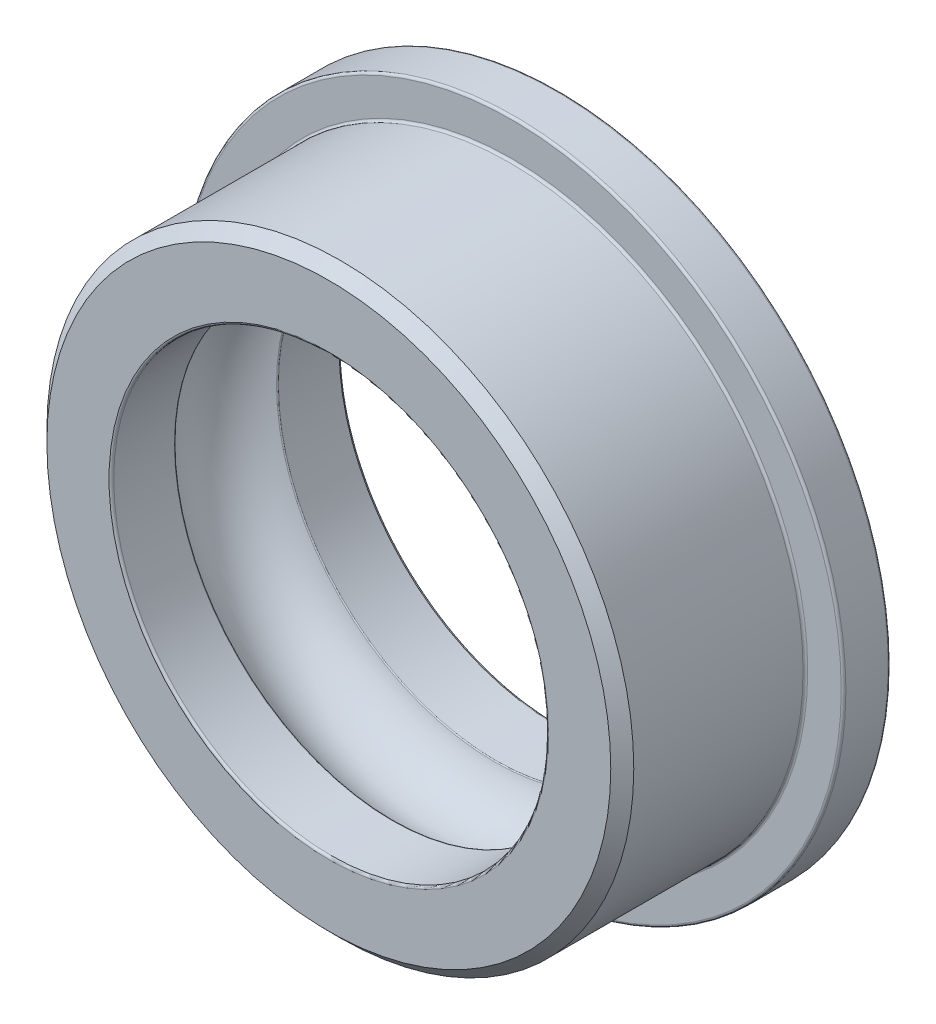
ISO-10303-21;
HEADER;
FILE_DESCRIPTION(('STEP AP214'),'2;1');
FILE_NAME('part.step','',(''),(''),'','','');
FILE_SCHEMA(('AUTOMOTIVE_DESIGN { 1 0 10303 214 1 1 1 1 }'));
ENDSEC;
DATA;
#1=APPLICATION_CONTEXT('core data for automotive mechanical design processes');
#2=APPLICATION_PROTOCOL_DEFINITION('international standard','automotive_design',2000,#1);
#3=PRODUCT_CONTEXT('',#1,'mechanical');
#4=PRODUCT('Part','Part','',(#3));
#5=PRODUCT_RELATED_PRODUCT_CATEGORY('part','',(#4));
#6=PRODUCT_DEFINITION_FORMATION('','',#4);
#7=PRODUCT_DEFINITION_CONTEXT('part definition',#1,'design');
#8=PRODUCT_DEFINITION('design','',#6,#7);
#9=PRODUCT_DEFINITION_SHAPE('','',#8);
#10=(LENGTH_UNIT() NAMED_UNIT(*) SI_UNIT(.MILLI.,.METRE.));
#11=(NAMED_UNIT(*) PLANE_ANGLE_UNIT() SI_UNIT($,.RADIAN.));
#12=(NAMED_UNIT(*) SI_UNIT($,.STERADIAN.) SOLID_ANGLE_UNIT());
#13=UNCERTAINTY_MEASURE_WITH_UNIT(LENGTH_MEASURE(1.E-05),#10,'distance_accuracy_value','');
#14=(GEOMETRIC_REPRESENTATION_CONTEXT(3) GLOBAL_UNCERTAINTY_ASSIGNED_CONTEXT((#13)) GLOBAL_UNIT_ASSIGNED_CONTEXT((#10,
#11,#12)) REPRESENTATION_CONTEXT('',''));
#15=CARTESIAN_POINT('',(0.,0.,0.));
#16=DIRECTION('',(0.,0.,1.));
#17=DIRECTION('',(1.,0.,0.));
#18=AXIS2_PLACEMENT_3D('',#15,#16,#17);
#19=CARTESIAN_POINT('',(0.,0.,2.24028));
#20=DIRECTION('',(0.,0.,-1.));
#21=DIRECTION('',(-1.,0.,0.));
#22=AXIS2_PLACEMENT_3D('',#19,#20,#21);
#23=CONICAL_SURFACE('',#22,6.35,0.785398163397453);
#24=CARTESIAN_POINT('',(0.,0.,2.4892));
#25=DIRECTION('',(0.,0.,1.));
#26=DIRECTION('',(1.,0.,0.));
#27=AXIS2_PLACEMENT_3D('',#24,#25,#26);
#28=CIRCLE('',#27,6.10108);
#29=CARTESIAN_POINT('',(6.10108,0.,2.4892));
#30=VERTEX_POINT('',#29);
#31=EDGE_CURVE('E10',#30,#30,#28,.T.);
#32=ORIENTED_EDGE('',*,*,#31,.F.);
#33=EDGE_LOOP('',(#32));
#34=FACE_BOUND('',#33,.T.);
#35=CARTESIAN_POINT('',(0.,0.,2.24028));
#36=DIRECTION('',(0.,0.,1.));
#37=DIRECTION('',(1.,0.,0.));
#38=AXIS2_PLACEMENT_3D('',#35,#36,#37);
#39=CIRCLE('',#38,6.35);
#40=CARTESIAN_POINT('',(6.35,0.,2.24028));
#41=VERTEX_POINT('',#40);
#42=EDGE_CURVE('E84',#41,#41,#39,.T.);
#43=ORIENTED_EDGE('',*,*,#42,.T.);
#44=EDGE_LOOP('',(#43));
#45=FACE_BOUND('',#44,.T.);
#46=ADVANCED_FACE('F32',(#34,#45),#23,.T.);
#47=CARTESIAN_POINT('',(0.,6.10108,2.4892));
#48=DIRECTION('',(0.,0.,-1.));
#49=DIRECTION('',(-1.,0.,0.));
#50=AXIS2_PLACEMENT_3D('',#47,#48,#49);
#51=PLANE('',#50);
#52=CARTESIAN_POINT('',(0.,0.,2.4892));
#53=DIRECTION('',(0.,0.,1.));
#54=DIRECTION('',(1.,0.,0.));
#55=AXIS2_PLACEMENT_3D('',#52,#53,#54);
#56=CIRCLE('',#55,4.75583598901099);
#57=CARTESIAN_POINT('',(4.75583598901099,0.,2.4892));
#58=VERTEX_POINT('',#57);
#59=EDGE_CURVE('E38',#58,#58,#56,.T.);
#60=ORIENTED_EDGE('',*,*,#59,.F.);
#61=EDGE_LOOP('',(#60));
#62=FACE_BOUND('',#61,.T.);
#63=ORIENTED_EDGE('',*,*,#31,.T.);
#64=EDGE_LOOP('',(#63));
#65=FACE_BOUND('',#64,.T.);
#66=ADVANCED_FACE('F169',(#62,#65),#51,.F.);
#67=CARTESIAN_POINT('',(0.,0.,2.4384));
#68=DIRECTION('',(0.,0.,1.));
#69=DIRECTION('',(1.,0.,0.));
#70=AXIS2_PLACEMENT_3D('',#67,#68,#69);
#71=TOROIDAL_SURFACE('',#70,4.75583598901099,0.0507999999999995);
#72=CARTESIAN_POINT('',(0.,0.,2.4384));
#73=DIRECTION('',(0.,0.,1.));
#74=DIRECTION('',(1.,0.,0.));
#75=AXIS2_PLACEMENT_3D('',#72,#73,#74);
#76=CIRCLE('',#75,4.70503598901099);
#77=CARTESIAN_POINT('',(4.70503598901099,0.,2.4384));
#78=VERTEX_POINT('',#77);
#79=EDGE_CURVE('E42',#78,#78,#76,.T.);
#80=ORIENTED_EDGE('',*,*,#79,.F.);
#81=EDGE_LOOP('',(#80));
#82=FACE_BOUND('',#81,.T.);
#83=ORIENTED_EDGE('',*,*,#59,.T.);
#84=EDGE_LOOP('',(#83));
#85=FACE_BOUND('',#84,.T.);
#86=ADVANCED_FACE('F164',(#82,#85),#71,.T.);
#87=CARTESIAN_POINT('',(0.,0.,2.4892));
#88=DIRECTION('',(0.,0.,1.));
#89=DIRECTION('',(1.,0.,0.));
#90=AXIS2_PLACEMENT_3D('',#87,#88,#89);
#91=CYLINDRICAL_SURFACE('',#90,4.70503598901099);
#92=CARTESIAN_POINT('',(0.,0.,1.12493032019577));
#93=DIRECTION('',(0.,0.,1.));
#94=DIRECTION('',(1.,0.,0.));
#95=AXIS2_PLACEMENT_3D('',#92,#93,#94);
#96=CIRCLE('',#95,4.70503598901099);
#97=CARTESIAN_POINT('',(4.70503598901099,0.,1.12493032019577));
#98=VERTEX_POINT('',#97);
#99=EDGE_CURVE('E46',#98,#98,#96,.T.);
#100=ORIENTED_EDGE('',*,*,#99,.F.);
#101=EDGE_LOOP('',(#100));
#102=FACE_BOUND('',#101,.T.);
#103=ORIENTED_EDGE('',*,*,#79,.T.);
#104=EDGE_LOOP('',(#103));
#105=FACE_BOUND('',#104,.T.);
#106=ADVANCED_FACE('F158',(#102,#105),#91,.F.);
#107=CARTESIAN_POINT('',(0.,0.,1.12493032019577));
#108=DIRECTION('',(0.,0.,1.));
#109=DIRECTION('',(1.,0.,0.));
#110=AXIS2_PLACEMENT_3D('',#107,#108,#109);
#111=TOROIDAL_SURFACE('',#110,4.73043598901099,0.0253999999999999);
#112=CARTESIAN_POINT('',(0.,0.,1.10076906346745));
#113=DIRECTION('',(0.,0.,1.));
#114=DIRECTION('',(1.,0.,0.));
#115=AXIS2_PLACEMENT_3D('',#112,#113,#114);
#116=CIRCLE('',#115,4.72260057751521);
#117=CARTESIAN_POINT('',(4.72260057751521,0.,1.10076906346745));
#118=VERTEX_POINT('',#117);
#119=EDGE_CURVE('E51',#118,#118,#116,.T.);
#120=ORIENTED_EDGE('',*,*,#119,.F.);
#121=EDGE_LOOP('',(#120));
#122=FACE_BOUND('',#121,.T.);
#123=ORIENTED_EDGE('',*,*,#99,.T.);
#124=EDGE_LOOP('',(#123));
#125=FACE_BOUND('',#124,.T.);
#126=ADVANCED_FACE('F152',(#122,#125),#111,.T.);
#127=CARTESIAN_POINT('',(0.,0.,0.));
#128=DIRECTION('',(0.,0.,1.));
#129=DIRECTION('',(1.,0.,0.));
#130=AXIS2_PLACEMENT_3D('',#127,#128,#129);
#131=TOROIDAL_SURFACE('',#130,4.365625,1.15720529467736);
#132=CARTESIAN_POINT('',(0.,0.,-1.10076906346744));
#133=DIRECTION('',(0.,0.,1.));
#134=DIRECTION('',(1.,0.,0.));
#135=AXIS2_PLACEMENT_3D('',#132,#133,#134);
#136=CIRCLE('',#135,4.72260057751522);
#137=CARTESIAN_POINT('',(4.72260057751522,0.,-1.10076906346744));
#138=VERTEX_POINT('',#137);
#139=EDGE_CURVE('E54',#138,#138,#136,.T.);
#140=ORIENTED_EDGE('',*,*,#139,.F.);
#141=EDGE_LOOP('',(#140));
#142=FACE_BOUND('',#141,.T.);
#143=ORIENTED_EDGE('',*,*,#119,.T.);
#144=EDGE_LOOP('',(#143));
#145=FACE_BOUND('',#144,.T.);
#146=ADVANCED_FACE('F146',(#142,#145),#131,.F.);
#147=CARTESIAN_POINT('',(0.,0.,-1.12493032019577));
#148=DIRECTION('',(0.,0.,1.));
#149=DIRECTION('',(1.,0.,0.));
#150=AXIS2_PLACEMENT_3D('',#147,#148,#149);
#151=TOROIDAL_SURFACE('',#150,4.73043598901099,0.0254000000000005);
#152=CARTESIAN_POINT('',(0.,0.,-1.12493032019577));
#153=DIRECTION('',(0.,0.,1.));
#154=DIRECTION('',(1.,0.,0.));
#155=AXIS2_PLACEMENT_3D('',#152,#153,#154);
#156=CIRCLE('',#155,4.70503598901099);
#157=CARTESIAN_POINT('',(4.70503598901099,0.,-1.12493032019577));
#158=VERTEX_POINT('',#157);
#159=EDGE_CURVE('E57',#158,#158,#156,.T.);
#160=ORIENTED_EDGE('',*,*,#159,.F.);
#161=EDGE_LOOP('',(#160));
#162=FACE_BOUND('',#161,.T.);
#163=ORIENTED_EDGE('',*,*,#139,.T.);
#164=EDGE_LOOP('',(#163));
#165=FACE_BOUND('',#164,.T.);
#166=ADVANCED_FACE('F140',(#162,#165),#151,.T.);
#167=CARTESIAN_POINT('',(0.,0.,2.4892));
#168=DIRECTION('',(0.,0.,1.));
#169=DIRECTION('',(1.,0.,0.));
#170=AXIS2_PLACEMENT_3D('',#167,#168,#169);
#171=CYLINDRICAL_SURFACE('',#170,4.70503598901099);
#172=CARTESIAN_POINT('',(0.,0.,-2.4384));
#173=DIRECTION('',(0.,0.,1.));
#174=DIRECTION('',(1.,0.,0.));
#175=AXIS2_PLACEMENT_3D('',#172,#173,#174);
#176=CIRCLE('',#175,4.70503598901099);
#177=CARTESIAN_POINT('',(4.70503598901099,0.,-2.4384));
#178=VERTEX_POINT('',#177);
#179=EDGE_CURVE('E60',#178,#178,#176,.T.);
#180=ORIENTED_EDGE('',*,*,#179,.F.);
#181=EDGE_LOOP('',(#180));
#182=FACE_BOUND('',#181,.T.);
#183=ORIENTED_EDGE('',*,*,#159,.T.);
#184=EDGE_LOOP('',(#183));
#185=FACE_BOUND('',#184,.T.);
#186=ADVANCED_FACE('F134',(#182,#185),#171,.F.);
#187=CARTESIAN_POINT('',(0.,0.,-2.4384));
#188=DIRECTION('',(0.,0.,1.));
#189=DIRECTION('',(1.,0.,0.));
#190=AXIS2_PLACEMENT_3D('',#187,#188,#189);
#191=TOROIDAL_SURFACE('',#190,4.75583598901099,0.0507999999999995);
#192=CARTESIAN_POINT('',(0.,0.,-2.4892));
#193=DIRECTION('',(0.,0.,1.));
#194=DIRECTION('',(1.,0.,0.));
#195=AXIS2_PLACEMENT_3D('',#192,#193,#194);
#196=CIRCLE('',#195,4.75583598901099);
#197=CARTESIAN_POINT('',(4.75583598901099,0.,-2.4892));
#198=VERTEX_POINT('',#197);
#199=EDGE_CURVE('E63',#198,#198,#196,.T.);
#200=ORIENTED_EDGE('',*,*,#199,.F.);
#201=EDGE_LOOP('',(#200));
#202=FACE_BOUND('',#201,.T.);
#203=ORIENTED_EDGE('',*,*,#179,.T.);
#204=EDGE_LOOP('',(#203));
#205=FACE_BOUND('',#204,.T.);
#206=ADVANCED_FACE('F128',(#202,#205),#191,.T.);
#207=CARTESIAN_POINT('',(0.,7.1247,-2.4892));
#208=DIRECTION('',(0.,0.,1.));
#209=DIRECTION('',(1.,0.,0.));
#210=AXIS2_PLACEMENT_3D('',#207,#208,#209);
#211=PLANE('',#210);
#212=CARTESIAN_POINT('',(0.,0.,-2.4892));
#213=DIRECTION('',(0.,0.,1.));
#214=DIRECTION('',(1.,0.,0.));
#215=AXIS2_PLACEMENT_3D('',#212,#213,#214);
#216=CIRCLE('',#215,7.1247);
#217=CARTESIAN_POINT('',(7.1247,0.,-2.4892));
#218=VERTEX_POINT('',#217);
#219=EDGE_CURVE('E66',#218,#218,#216,.T.);
#220=ORIENTED_EDGE('',*,*,#219,.F.);
#221=EDGE_LOOP('',(#220));
#222=FACE_BOUND('',#221,.T.);
#223=ORIENTED_EDGE('',*,*,#199,.T.);
#224=EDGE_LOOP('',(#223));
#225=FACE_BOUND('',#224,.T.);
#226=ADVANCED_FACE('F122',(#222,#225),#211,.F.);
#227=CARTESIAN_POINT('',(0.,0.,-2.4384));
#228=DIRECTION('',(0.,0.,1.));
#229=DIRECTION('',(1.,0.,0.));
#230=AXIS2_PLACEMENT_3D('',#227,#228,#229);
#231=TOROIDAL_SURFACE('',#230,7.1247,0.0508000000000002);
#232=CARTESIAN_POINT('',(0.,0.,-2.4384));
#233=DIRECTION('',(0.,0.,1.));
#234=DIRECTION('',(1.,0.,0.));
#235=AXIS2_PLACEMENT_3D('',#232,#233,#234);
#236=CIRCLE('',#235,7.1755);
#237=CARTESIAN_POINT('',(7.1755,0.,-2.4384));
#238=VERTEX_POINT('',#237);
#239=EDGE_CURVE('E69',#238,#238,#236,.T.);
#240=ORIENTED_EDGE('',*,*,#239,.F.);
#241=EDGE_LOOP('',(#240));
#242=FACE_BOUND('',#241,.T.);
#243=ORIENTED_EDGE('',*,*,#219,.T.);
#244=EDGE_LOOP('',(#243));
#245=FACE_BOUND('',#244,.T.);
#246=ADVANCED_FACE('F116',(#242,#245),#231,.T.);
#247=CARTESIAN_POINT('',(0.,0.,2.4892));
#248=DIRECTION('',(0.,0.,1.));
#249=DIRECTION('',(1.,0.,0.));
#250=AXIS2_PLACEMENT_3D('',#247,#248,#249);
#251=CYLINDRICAL_SURFACE('',#250,7.1755);
#252=CARTESIAN_POINT('',(0.,0.,-1.524));
#253=DIRECTION('',(0.,0.,1.));
#254=DIRECTION('',(1.,0.,0.));
#255=AXIS2_PLACEMENT_3D('',#252,#253,#254);
#256=CIRCLE('',#255,7.1755);
#257=CARTESIAN_POINT('',(7.1755,0.,-1.524));
#258=VERTEX_POINT('',#257);
#259=EDGE_CURVE('E72',#258,#258,#256,.T.);
#260=ORIENTED_EDGE('',*,*,#259,.F.);
#261=EDGE_LOOP('',(#260));
#262=FACE_BOUND('',#261,.T.);
#263=ORIENTED_EDGE('',*,*,#239,.T.);
#264=EDGE_LOOP('',(#263));
#265=FACE_BOUND('',#264,.T.);
#266=ADVANCED_FACE('F110',(#262,#265),#251,.T.);
#267=CARTESIAN_POINT('',(0.,0.,-1.524));
#268=DIRECTION('',(0.,0.,1.));
#269=DIRECTION('',(1.,0.,0.));
#270=AXIS2_PLACEMENT_3D('',#267,#268,#269);
#271=TOROIDAL_SURFACE('',#270,7.1247,0.0508);
#272=CARTESIAN_POINT('',(0.,0.,-1.4732));
#273=DIRECTION('',(0.,0.,1.));
#274=DIRECTION('',(1.,0.,0.));
#275=AXIS2_PLACEMENT_3D('',#272,#273,#274);
#276=CIRCLE('',#275,7.1247);
#277=CARTESIAN_POINT('',(7.1247,0.,-1.4732));
#278=VERTEX_POINT('',#277);
#279=EDGE_CURVE('E75',#278,#278,#276,.T.);
#280=ORIENTED_EDGE('',*,*,#279,.F.);
#281=EDGE_LOOP('',(#280));
#282=FACE_BOUND('',#281,.T.);
#283=ORIENTED_EDGE('',*,*,#259,.T.);
#284=EDGE_LOOP('',(#283));
#285=FACE_BOUND('',#284,.T.);
#286=ADVANCED_FACE('F104',(#282,#285),#271,.T.);
#287=CARTESIAN_POINT('',(0.,6.4008,-1.4732));
#288=DIRECTION('',(0.,0.,-1.));
#289=DIRECTION('',(-1.,0.,0.));
#290=AXIS2_PLACEMENT_3D('',#287,#288,#289);
#291=PLANE('',#290);
#292=CARTESIAN_POINT('',(0.,0.,-1.4732));
#293=DIRECTION('',(0.,0.,1.));
#294=DIRECTION('',(1.,0.,0.));
#295=AXIS2_PLACEMENT_3D('',#292,#293,#294);
#296=CIRCLE('',#295,6.4008);
#297=CARTESIAN_POINT('',(6.4008,0.,-1.4732));
#298=VERTEX_POINT('',#297);
#299=EDGE_CURVE('E78',#298,#298,#296,.T.);
#300=ORIENTED_EDGE('',*,*,#299,.F.);
#301=EDGE_LOOP('',(#300));
#302=FACE_BOUND('',#301,.T.);
#303=ORIENTED_EDGE('',*,*,#279,.T.);
#304=EDGE_LOOP('',(#303));
#305=FACE_BOUND('',#304,.T.);
#306=ADVANCED_FACE('F98',(#302,#305),#291,.F.);
#307=CARTESIAN_POINT('',(0.,0.,-1.4224));
#308=DIRECTION('',(0.,0.,1.));
#309=DIRECTION('',(1.,0.,0.));
#310=AXIS2_PLACEMENT_3D('',#307,#308,#309);
#311=TOROIDAL_SURFACE('',#310,6.4008,0.0508);
#312=CARTESIAN_POINT('',(0.,0.,-1.4224));
#313=DIRECTION('',(0.,0.,1.));
#314=DIRECTION('',(1.,0.,0.));
#315=AXIS2_PLACEMENT_3D('',#312,#313,#314);
#316=CIRCLE('',#315,6.35);
#317=CARTESIAN_POINT('',(6.35,0.,-1.4224));
#318=VERTEX_POINT('',#317);
#319=EDGE_CURVE('E81',#318,#318,#316,.T.);
#320=ORIENTED_EDGE('',*,*,#319,.F.);
#321=EDGE_LOOP('',(#320));
#322=FACE_BOUND('',#321,.T.);
#323=ORIENTED_EDGE('',*,*,#299,.T.);
#324=EDGE_LOOP('',(#323));
#325=FACE_BOUND('',#324,.T.);
#326=ADVANCED_FACE('F92',(#322,#325),#311,.F.);
#327=CARTESIAN_POINT('',(0.,0.,2.4892));
#328=DIRECTION('',(0.,0.,1.));
#329=DIRECTION('',(1.,0.,0.));
#330=AXIS2_PLACEMENT_3D('',#327,#328,#329);
#331=CYLINDRICAL_SURFACE('',#330,6.35);
#332=ORIENTED_EDGE('',*,*,#42,.F.);
#333=EDGE_LOOP('',(#332));
#334=FACE_BOUND('',#333,.T.);
#335=ORIENTED_EDGE('',*,*,#319,.T.);
#336=EDGE_LOOP('',(#335));
#337=FACE_BOUND('',#336,.T.);
#338=ADVANCED_FACE('F89',(#334,#337),#331,.T.);
#339=CLOSED_SHELL('',(#46,#66,#86,#106,#126,#146,#166,#186,#206,#226,#246,#266,#286,#306,#326,#338));
#340=MANIFOLD_SOLID_BREP('B2',#339);
#341=ADVANCED_BREP_SHAPE_REPRESENTATION('',(#18,#340),#14);
#342=SHAPE_DEFINITION_REPRESENTATION(#9,#341);
ENDSEC;
END-ISO-10303-21;
